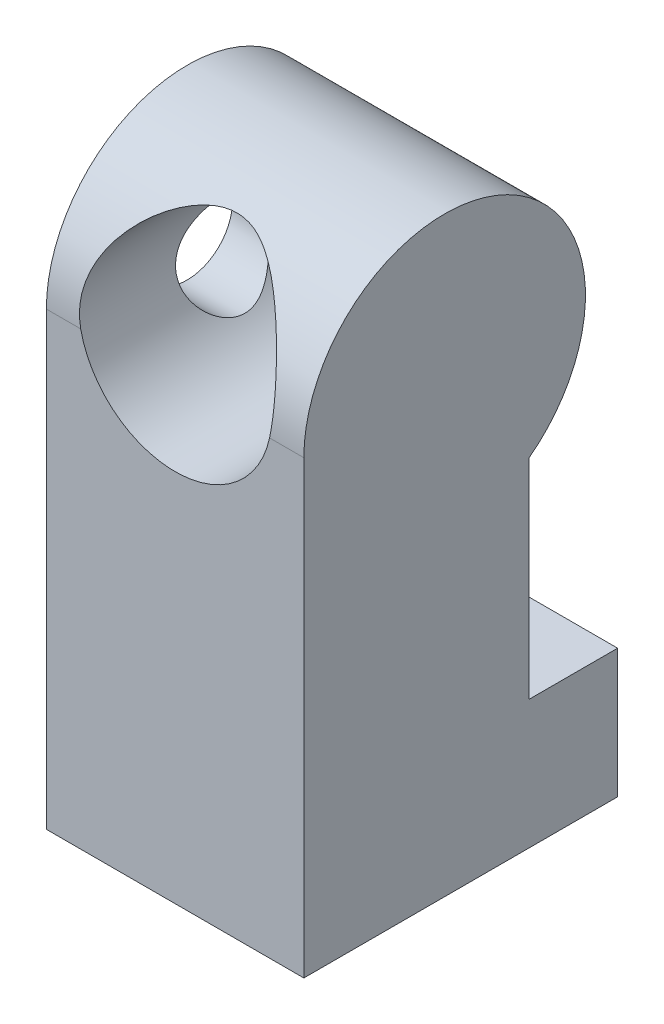
ISO-10303-21;
HEADER;
FILE_DESCRIPTION(('STEP AP214'),'2;1');
FILE_NAME('part.step','',(''),(''),'','','');
FILE_SCHEMA(('AUTOMOTIVE_DESIGN { 1 0 10303 214 1 1 1 1 }'));
ENDSEC;
DATA;
#1=APPLICATION_CONTEXT('core data for automotive mechanical design processes');
#2=APPLICATION_PROTOCOL_DEFINITION('international standard','automotive_design',2000,#1);
#3=PRODUCT_CONTEXT('',#1,'mechanical');
#4=PRODUCT('Part','Part','',(#3));
#5=PRODUCT_RELATED_PRODUCT_CATEGORY('part','',(#4));
#6=PRODUCT_DEFINITION_FORMATION('','',#4);
#7=PRODUCT_DEFINITION_CONTEXT('part definition',#1,'design');
#8=PRODUCT_DEFINITION('design','',#6,#7);
#9=PRODUCT_DEFINITION_SHAPE('','',#8);
#10=(LENGTH_UNIT() NAMED_UNIT(*) SI_UNIT(.MILLI.,.METRE.));
#11=(NAMED_UNIT(*) PLANE_ANGLE_UNIT() SI_UNIT($,.RADIAN.));
#12=(NAMED_UNIT(*) SI_UNIT($,.STERADIAN.) SOLID_ANGLE_UNIT());
#13=UNCERTAINTY_MEASURE_WITH_UNIT(LENGTH_MEASURE(1.E-05),#10,'distance_accuracy_value','');
#14=(GEOMETRIC_REPRESENTATION_CONTEXT(3) GLOBAL_UNCERTAINTY_ASSIGNED_CONTEXT((#13)) GLOBAL_UNIT_ASSIGNED_CONTEXT((#10,
#11,#12)) REPRESENTATION_CONTEXT('',''));
#15=CARTESIAN_POINT('',(0.,0.,0.));
#16=DIRECTION('',(0.,0.,1.));
#17=DIRECTION('',(1.,0.,0.));
#18=AXIS2_PLACEMENT_3D('',#15,#16,#17);
#19=CARTESIAN_POINT('',(3.2,3.2,0.));
#20=DIRECTION('',(0.,0.,1.));
#21=DIRECTION('',(0.,-1.,0.));
#22=AXIS2_PLACEMENT_3D('',#19,#20,#21);
#23=PLANE('',#22);
#24=DIRECTION('',(0.,1.,0.));
#25=VECTOR('',#24,1.);
#26=CARTESIAN_POINT('',(-3.2,3.2,0.));
#27=LINE('',#26,#25);
#28=CARTESIAN_POINT('',(-3.2,0.,0.));
#29=VERTEX_POINT('',#28);
#30=CARTESIAN_POINT('',(-3.2,3.2,0.));
#31=VERTEX_POINT('',#30);
#32=EDGE_CURVE('E168',#29,#31,#27,.T.);
#33=ORIENTED_EDGE('',*,*,#32,.T.);
#34=DIRECTION('',(-1.,0.,0.));
#35=VECTOR('',#34,1.);
#36=CARTESIAN_POINT('',(3.2,3.2,0.));
#37=LINE('',#36,#35);
#38=CARTESIAN_POINT('',(3.2,3.2,0.));
#39=VERTEX_POINT('',#38);
#40=EDGE_CURVE('E11',#39,#31,#37,.T.);
#41=ORIENTED_EDGE('',*,*,#40,.F.);
#42=DIRECTION('',(0.,1.,0.));
#43=VECTOR('',#42,1.);
#44=CARTESIAN_POINT('',(3.2,3.2,0.));
#45=LINE('',#44,#43);
#46=CARTESIAN_POINT('',(3.2,0.,0.));
#47=VERTEX_POINT('',#46);
#48=EDGE_CURVE('E174',#47,#39,#45,.T.);
#49=ORIENTED_EDGE('',*,*,#48,.F.);
#50=DIRECTION('',(-1.,0.,0.));
#51=VECTOR('',#50,1.);
#52=CARTESIAN_POINT('',(3.2,0.,0.));
#53=LINE('',#52,#51);
#54=EDGE_CURVE('E175',#47,#29,#53,.T.);
#55=ORIENTED_EDGE('',*,*,#54,.T.);
#56=EDGE_LOOP('',(#33,#41,#49,#55));
#57=FACE_BOUND('',#56,.T.);
#58=ADVANCED_FACE('F35',(#57),#23,.F.);
#59=CARTESIAN_POINT('',(3.2,3.20000000000001,2.19999999999999));
#60=DIRECTION('',(0.,-1.,0.));
#61=DIRECTION('',(0.,0.,-1.));
#62=AXIS2_PLACEMENT_3D('',#59,#60,#61);
#63=PLANE('',#62);
#64=DIRECTION('',(0.,0.,1.));
#65=VECTOR('',#64,1.);
#66=CARTESIAN_POINT('',(-3.2,3.20000000000001,2.19999999999999));
#67=LINE('',#66,#65);
#68=CARTESIAN_POINT('',(-3.2,3.20000000000001,2.19999999999999));
#69=VERTEX_POINT('',#68);
#70=EDGE_CURVE('E162',#31,#69,#67,.T.);
#71=ORIENTED_EDGE('',*,*,#70,.T.);
#72=DIRECTION('',(-1.,0.,0.));
#73=VECTOR('',#72,1.);
#74=CARTESIAN_POINT('',(3.2,3.20000000000001,2.19999999999999));
#75=LINE('',#74,#73);
#76=CARTESIAN_POINT('',(3.2,3.20000000000001,2.19999999999999));
#77=VERTEX_POINT('',#76);
#78=EDGE_CURVE('E48',#77,#69,#75,.T.);
#79=ORIENTED_EDGE('',*,*,#78,.F.);
#80=DIRECTION('',(0.,0.,1.));
#81=VECTOR('',#80,1.);
#82=CARTESIAN_POINT('',(3.2,3.20000000000001,2.19999999999999));
#83=LINE('',#82,#81);
#84=EDGE_CURVE('E207',#39,#77,#83,.T.);
#85=ORIENTED_EDGE('',*,*,#84,.F.);
#86=ORIENTED_EDGE('',*,*,#40,.T.);
#87=EDGE_LOOP('',(#71,#79,#85,#86));
#88=FACE_BOUND('',#87,.T.);
#89=ADVANCED_FACE('F213',(#88),#63,.F.);
#90=CARTESIAN_POINT('',(3.2,8.4,2.2));
#91=DIRECTION('',(0.,0.,1.));
#92=DIRECTION('',(0.,-1.,0.));
#93=AXIS2_PLACEMENT_3D('',#90,#91,#92);
#94=PLANE('',#93);
#95=DIRECTION('',(0.,1.,0.));
#96=VECTOR('',#95,1.);
#97=CARTESIAN_POINT('',(-3.2,8.4,2.2));
#98=LINE('',#97,#96);
#99=CARTESIAN_POINT('',(-3.2,8.4,2.2));
#100=VERTEX_POINT('',#99);
#101=EDGE_CURVE('E155',#69,#100,#98,.T.);
#102=ORIENTED_EDGE('',*,*,#101,.T.);
#103=DIRECTION('',(-1.,0.,0.));
#104=VECTOR('',#103,1.);
#105=CARTESIAN_POINT('',(3.2,8.4,2.2));
#106=LINE('',#105,#104);
#107=CARTESIAN_POINT('',(3.2,8.4,2.2));
#108=VERTEX_POINT('',#107);
#109=EDGE_CURVE('E140',#108,#100,#106,.T.);
#110=ORIENTED_EDGE('',*,*,#109,.F.);
#111=DIRECTION('',(0.,1.,0.));
#112=VECTOR('',#111,1.);
#113=CARTESIAN_POINT('',(3.2,8.4,2.2));
#114=LINE('',#113,#112);
#115=EDGE_CURVE('E156',#77,#108,#114,.T.);
#116=ORIENTED_EDGE('',*,*,#115,.F.);
#117=ORIENTED_EDGE('',*,*,#78,.T.);
#118=EDGE_LOOP('',(#102,#110,#116,#117));
#119=FACE_BOUND('',#118,.T.);
#120=ADVANCED_FACE('F153',(#119),#94,.F.);
#121=CARTESIAN_POINT('',(3.2,11.2,4.3));
#122=DIRECTION('',(-1.,0.,0.));
#123=DIRECTION('',(0.,0.,1.));
#124=AXIS2_PLACEMENT_3D('',#121,#122,#123);
#125=CYLINDRICAL_SURFACE('',#124,3.5);
#126=DIRECTION('',(-1.,0.,0.));
#127=VECTOR('',#126,1.);
#128=CARTESIAN_POINT('',(3.2,11.2,7.8));
#129=LINE('',#128,#127);
#130=CARTESIAN_POINT('',(-2.3473389188611,11.2,7.8));
#131=VERTEX_POINT('',#130);
#132=CARTESIAN_POINT('',(-3.2,11.2,7.8));
#133=VERTEX_POINT('',#132);
#134=EDGE_CURVE('E134',#131,#133,#129,.T.);
#135=ORIENTED_EDGE('',*,*,#134,.F.);
#136=CARTESIAN_POINT('',(-2.3473389188611,11.2,7.8));
#137=CARTESIAN_POINT('',(-2.35952324799212,11.2571477217374,7.80001181867057));
#138=CARTESIAN_POINT('',(-2.36959863933398,11.3147437700653,7.79860061614223));
#139=CARTESIAN_POINT('',(-2.38551560428378,11.4303604078272,7.79288728833139));
#140=CARTESIAN_POINT('',(-2.39135828784083,11.4883808819292,7.78858592151156));
#141=CARTESIAN_POINT('',(-2.3987800738924,11.6040893596738,7.77707880110764));
#142=CARTESIAN_POINT('',(-2.40038218120076,11.6617774560698,7.76988896332483));
#143=CARTESIAN_POINT('',(-2.39946378384657,11.7766765678628,7.75265487837301));
#144=CARTESIAN_POINT('',(-2.39694326407962,11.8338875815112,7.74261062074615));
#145=CARTESIAN_POINT('',(-2.38336595556229,12.0041050362091,7.7083356117771));
#146=CARTESIAN_POINT('',(-2.36630384227635,12.1158698662925,7.67994514796453));
#147=CARTESIAN_POINT('',(-2.3176646602164,12.3331483242968,7.61344895138059));
#148=CARTESIAN_POINT('',(-2.28607230536925,12.4386552364825,7.57533300607753));
#149=CARTESIAN_POINT('',(-2.20809491628295,12.6473156467437,7.48884504357403));
#150=CARTESIAN_POINT('',(-2.16097838899282,12.7500037379456,7.44001706082533));
#151=CARTESIAN_POINT('',(-2.05467670041225,12.9452636074864,7.335840219662));
#152=CARTESIAN_POINT('',(-1.99548649772665,13.037831135076,7.28048864139242));
#153=CARTESIAN_POINT('',(-1.8535357377681,13.2301856227216,7.15379750966277));
#154=CARTESIAN_POINT('',(-1.76842986956987,13.3276050228198,7.08149734246403));
#155=CARTESIAN_POINT('',(-1.58471660055204,13.5069850297708,6.93462775579362));
#156=CARTESIAN_POINT('',(-1.48609165576466,13.5889252148605,6.86005548720431));
#157=CARTESIAN_POINT('',(-1.28326463330636,13.7316290827611,6.71871956278775));
#158=CARTESIAN_POINT('',(-1.17995301376685,13.7934819252775,6.65177703389459));
#159=CARTESIAN_POINT('',(-0.961384510809961,13.9024084058305,6.52572729179699));
#160=CARTESIAN_POINT('',(-0.846154035362334,13.94951382379,6.46660339102304));
#161=CARTESIAN_POINT('',(-0.647727577127012,14.0123430464996,6.38383834027692));
#162=CARTESIAN_POINT('',(-0.56831867472429,14.0332378876336,6.35514190190293));
#163=CARTESIAN_POINT('',(-0.404993818729679,14.0670453902327,6.3077106103014));
#164=CARTESIAN_POINT('',(-0.321088276567455,14.0799756925631,6.28895375460871));
#165=CARTESIAN_POINT('',(-0.149491208394771,14.0969014461754,6.2642337035912));
#166=CARTESIAN_POINT('',(-0.061768949036159,14.1008005995437,6.25840842288825));
#167=CARTESIAN_POINT('',(0.113347387177273,14.0989222746351,6.26118525247281));
#168=CARTESIAN_POINT('',(0.200741362317399,14.0931420111559,6.26979151536346));
#169=CARTESIAN_POINT('',(0.38002426984234,14.0716013071517,6.3010690476172));
#170=CARTESIAN_POINT('',(0.471581842713509,14.0549676323807,6.32496702821198));
#171=CARTESIAN_POINT('',(0.648946825699923,14.0124101926336,6.38366151371945));
#172=CARTESIAN_POINT('',(0.734736399221444,13.9864590543929,6.41849009267811));
#173=CARTESIAN_POINT('',(0.882269209875887,13.9330157141791,6.48679788954712));
#174=CARTESIAN_POINT('',(0.945212765686842,13.9070584023299,6.51895300854011));
#175=CARTESIAN_POINT('',(1.06746047311732,13.8505953738598,6.58610481874926));
#176=CARTESIAN_POINT('',(1.12676250614175,13.8200870442471,6.62110313711189));
#177=CARTESIAN_POINT('',(1.29954031385501,13.7220720622161,6.72868720689748));
#178=CARTESIAN_POINT('',(1.40781900138491,13.6481010718627,6.80382746204864));
#179=CARTESIAN_POINT('',(1.61639176669799,13.4793913271792,6.95861963929727));
#180=CARTESIAN_POINT('',(1.71592187098403,13.383735839555,7.03829291655651));
#181=CARTESIAN_POINT('',(1.89862659550262,13.1745927626624,7.19271972414267));
#182=CARTESIAN_POINT('',(1.98182520751841,13.0611317785763,7.26748036225121));
#183=CARTESIAN_POINT('',(2.11729235303731,12.8364166045219,7.39615262794246));
#184=CARTESIAN_POINT('',(2.17237560238322,12.7276812865925,7.45148910825451));
#185=CARTESIAN_POINT('',(2.26644162806675,12.4990375293626,7.55238946581503));
#186=CARTESIAN_POINT('',(2.30542916484462,12.3791324065019,7.59795623061858));
#187=CARTESIAN_POINT('',(2.3498291454817,12.1924122450753,7.65700281785587));
#188=CARTESIAN_POINT('',(2.36230923884271,12.1286856010148,7.67520301505509));
#189=CARTESIAN_POINT('',(2.38212491102286,11.999562026687,7.70809707788925));
#190=CARTESIAN_POINT('',(2.38946329864895,11.9341660286224,7.72279285501696));
#191=CARTESIAN_POINT('',(2.39872518579679,11.802361890113,7.74842924317227));
#192=CARTESIAN_POINT('',(2.40065641613778,11.7359553313239,7.75937519578144));
#193=CARTESIAN_POINT('',(2.39895186636154,11.6027230568351,7.77740236223998));
#194=CARTESIAN_POINT('',(2.39531979451449,11.5358976498855,7.7844861461866));
#195=CARTESIAN_POINT('',(2.38451462581159,11.4240465803309,7.79311564200003));
#196=CARTESIAN_POINT('',(2.37886287652598,11.3789465891278,7.79571088870466));
#197=CARTESIAN_POINT('',(2.3650076462582,11.2891432677127,7.79915350020635));
#198=CARTESIAN_POINT('',(2.35680805913186,11.2444394385562,7.80000351725482));
#199=CARTESIAN_POINT('',(2.3473389188611,11.2,7.8));
#200=B_SPLINE_CURVE_WITH_KNOTS('',3,(#136,#137,#138,#139,#140,#141,#142,#143,#144,#145,#146,
#147,#148,#149,#150,#151,#152,#153,#154,#155,#156,#157,#158,#159,#160,#161,#162,#163,#164,#165,
#166,#167,#168,#169,#170,#171,#172,#173,#174,#175,#176,#177,#178,#179,#180,#181,#182,#183,#184,
#185,#186,#187,#188,#189,#190,#191,#192,#193,#194,#195,#196,#197,#198,#199),.UNSPECIFIED.,.F.,
.F.,(4,2,2,2,2,2,2,2,2,2,2,2,2,2,2,2,2,2,2,2,2,2,2,2,2,2,2,2,2,2,2,4),(0.,0.175237440381034,
0.35042891134353,0.524668014814339,0.698907756660256,1.04686867533736,1.39519649537508,
1.76309807782819,2.13115359418281,2.57414809278723,3.01772301461146,3.42986501795747,
3.84111266440891,4.10124897819194,4.36080701764206,4.62312019539684,4.88550886538463,
5.17215450827925,5.45964925644542,5.68524281978454,5.91096641102047,6.36265437457839,
6.83912330739457,7.31488695708917,7.71498529590946,8.1149652174138,8.31702682714793,
8.51897796858323,8.720640224955,8.92216811998134,9.0586481727044,9.19492066068158),.UNSPECIFIED.);
#201=CARTESIAN_POINT('',(2.3473389188611,11.2,7.8));
#202=VERTEX_POINT('',#201);
#203=EDGE_CURVE('E54',#131,#202,#200,.T.);
#204=ORIENTED_EDGE('',*,*,#203,.T.);
#205=CARTESIAN_POINT('',(3.2,11.2,7.8));
#206=VERTEX_POINT('',#205);
#207=EDGE_CURVE('E131',#206,#202,#129,.T.);
#208=ORIENTED_EDGE('',*,*,#207,.F.);
#209=CARTESIAN_POINT('',(3.2,11.2,4.3));
#210=DIRECTION('',(1.,0.,0.));
#211=DIRECTION('',(0.,0.,-1.));
#212=AXIS2_PLACEMENT_3D('',#209,#210,#211);
#213=CIRCLE('',#212,3.5);
#214=EDGE_CURVE('E187',#108,#206,#213,.T.);
#215=ORIENTED_EDGE('',*,*,#214,.F.);
#216=ORIENTED_EDGE('',*,*,#109,.T.);
#217=CARTESIAN_POINT('',(-3.2,11.2,4.3));
#218=DIRECTION('',(1.,0.,0.));
#219=DIRECTION('',(0.,0.,-1.));
#220=AXIS2_PLACEMENT_3D('',#217,#218,#219);
#221=CIRCLE('',#220,3.5);
#222=EDGE_CURVE('E164',#100,#133,#221,.T.);
#223=ORIENTED_EDGE('',*,*,#222,.T.);
#224=EDGE_LOOP('',(#135,#204,#208,#215,#216,#223));
#225=FACE_BOUND('',#224,.T.);
#226=ADVANCED_FACE('F129',(#225),#125,.T.);
#227=CARTESIAN_POINT('',(3.2,0.,7.8));
#228=DIRECTION('',(0.,0.,-1.));
#229=DIRECTION('',(-1.,0.,0.));
#230=AXIS2_PLACEMENT_3D('',#227,#228,#229);
#231=PLANE('',#230);
#232=ORIENTED_EDGE('',*,*,#207,.T.);
#233=CARTESIAN_POINT('',(0.,11.7,7.8));
#234=DIRECTION('',(0.,0.,1.));
#235=DIRECTION('',(1.,0.,0.));
#236=AXIS2_PLACEMENT_3D('',#233,#234,#235);
#237=CIRCLE('',#236,2.4);
#238=EDGE_CURVE('E120',#131,#202,#237,.T.);
#239=ORIENTED_EDGE('',*,*,#238,.F.);
#240=ORIENTED_EDGE('',*,*,#134,.T.);
#241=DIRECTION('',(0.,-1.,0.));
#242=VECTOR('',#241,1.);
#243=CARTESIAN_POINT('',(-3.2,0.,7.8));
#244=LINE('',#243,#242);
#245=CARTESIAN_POINT('',(-3.2,0.,7.8));
#246=VERTEX_POINT('',#245);
#247=EDGE_CURVE('E166',#133,#246,#244,.T.);
#248=ORIENTED_EDGE('',*,*,#247,.T.);
#249=DIRECTION('',(-1.,0.,0.));
#250=VECTOR('',#249,1.);
#251=CARTESIAN_POINT('',(3.2,0.,7.8));
#252=LINE('',#251,#250);
#253=CARTESIAN_POINT('',(3.2,0.,7.8));
#254=VERTEX_POINT('',#253);
#255=EDGE_CURVE('E144',#254,#246,#252,.T.);
#256=ORIENTED_EDGE('',*,*,#255,.F.);
#257=DIRECTION('',(0.,-1.,0.));
#258=VECTOR('',#257,1.);
#259=CARTESIAN_POINT('',(3.2,0.,7.8));
#260=LINE('',#259,#258);
#261=EDGE_CURVE('E139',#206,#254,#260,.T.);
#262=ORIENTED_EDGE('',*,*,#261,.F.);
#263=EDGE_LOOP('',(#232,#239,#240,#248,#256,#262));
#264=FACE_BOUND('',#263,.T.);
#265=ADVANCED_FACE('F137',(#264),#231,.F.);
#266=CARTESIAN_POINT('',(3.2,0.,0.));
#267=DIRECTION('',(0.,1.,0.));
#268=DIRECTION('',(0.,0.,1.));
#269=AXIS2_PLACEMENT_3D('',#266,#267,#268);
#270=PLANE('',#269);
#271=DIRECTION('',(-1.,0.,0.));
#272=VECTOR('',#271,1.);
#273=CARTESIAN_POINT('',(-2.4,0.,6.4));
#274=LINE('',#273,#272);
#275=CARTESIAN_POINT('',(2.4,0.,6.4));
#276=VERTEX_POINT('',#275);
#277=CARTESIAN_POINT('',(-2.4,0.,6.4));
#278=VERTEX_POINT('',#277);
#279=EDGE_CURVE('E274',#276,#278,#274,.T.);
#280=ORIENTED_EDGE('',*,*,#279,.F.);
#281=DIRECTION('',(0.,0.,1.));
#282=VECTOR('',#281,1.);
#283=CARTESIAN_POINT('',(2.4,0.,3.1));
#284=LINE('',#283,#282);
#285=CARTESIAN_POINT('',(2.4,0.,3.1));
#286=VERTEX_POINT('',#285);
#287=EDGE_CURVE('E62',#286,#276,#284,.T.);
#288=ORIENTED_EDGE('',*,*,#287,.F.);
#289=DIRECTION('',(1.,0.,0.));
#290=VECTOR('',#289,1.);
#291=CARTESIAN_POINT('',(-2.4,0.,3.1));
#292=LINE('',#291,#290);
#293=CARTESIAN_POINT('',(-2.4,0.,3.1));
#294=VERTEX_POINT('',#293);
#295=EDGE_CURVE('E199',#294,#286,#292,.T.);
#296=ORIENTED_EDGE('',*,*,#295,.F.);
#297=DIRECTION('',(0.,0.,-1.));
#298=VECTOR('',#297,1.);
#299=CARTESIAN_POINT('',(-2.4,0.,3.1));
#300=LINE('',#299,#298);
#301=EDGE_CURVE('E277',#278,#294,#300,.T.);
#302=ORIENTED_EDGE('',*,*,#301,.F.);
#303=EDGE_LOOP('',(#280,#288,#296,#302));
#304=FACE_BOUND('',#303,.T.);
#305=DIRECTION('',(0.,0.,-1.));
#306=VECTOR('',#305,1.);
#307=CARTESIAN_POINT('',(-3.2,0.,0.));
#308=LINE('',#307,#306);
#309=EDGE_CURVE('E173',#246,#29,#308,.T.);
#310=ORIENTED_EDGE('',*,*,#309,.T.);
#311=ORIENTED_EDGE('',*,*,#54,.F.);
#312=DIRECTION('',(0.,0.,-1.));
#313=VECTOR('',#312,1.);
#314=CARTESIAN_POINT('',(3.2,0.,0.));
#315=LINE('',#314,#313);
#316=EDGE_CURVE('E177',#254,#47,#315,.T.);
#317=ORIENTED_EDGE('',*,*,#316,.F.);
#318=ORIENTED_EDGE('',*,*,#255,.T.);
#319=EDGE_LOOP('',(#310,#311,#317,#318));
#320=FACE_BOUND('',#319,.T.);
#321=ADVANCED_FACE('F212',(#304,#320),#270,.F.);
#322=CARTESIAN_POINT('',(3.2,11.2,4.3));
#323=DIRECTION('',(1.,0.,0.));
#324=DIRECTION('',(0.,0.,-1.));
#325=AXIS2_PLACEMENT_3D('',#322,#323,#324);
#326=PLANE('',#325);
#327=ORIENTED_EDGE('',*,*,#48,.T.);
#328=ORIENTED_EDGE('',*,*,#84,.T.);
#329=ORIENTED_EDGE('',*,*,#115,.T.);
#330=ORIENTED_EDGE('',*,*,#214,.T.);
#331=ORIENTED_EDGE('',*,*,#261,.T.);
#332=ORIENTED_EDGE('',*,*,#316,.T.);
#333=EDGE_LOOP('',(#327,#328,#329,#330,#331,#332));
#334=FACE_BOUND('',#333,.T.);
#335=ADVANCED_FACE('F209',(#334),#326,.T.);
#336=CARTESIAN_POINT('',(-3.2,11.2,4.3));
#337=DIRECTION('',(1.,0.,0.));
#338=DIRECTION('',(0.,0.,-1.));
#339=AXIS2_PLACEMENT_3D('',#336,#337,#338);
#340=PLANE('',#339);
#341=CARTESIAN_POINT('',(-3.2,11.2,4.3));
#342=DIRECTION('',(-1.,0.,0.));
#343=DIRECTION('',(0.,0.,1.));
#344=AXIS2_PLACEMENT_3D('',#341,#342,#343);
#345=CIRCLE('',#344,1.125);
#346=CARTESIAN_POINT('',(-3.2,11.2,5.425));
#347=VERTEX_POINT('',#346);
#348=EDGE_CURVE('E135',#347,#347,#345,.T.);
#349=ORIENTED_EDGE('',*,*,#348,.F.);
#350=EDGE_LOOP('',(#349));
#351=FACE_BOUND('',#350,.T.);
#352=ORIENTED_EDGE('',*,*,#32,.F.);
#353=ORIENTED_EDGE('',*,*,#309,.F.);
#354=ORIENTED_EDGE('',*,*,#247,.F.);
#355=ORIENTED_EDGE('',*,*,#222,.F.);
#356=ORIENTED_EDGE('',*,*,#101,.F.);
#357=ORIENTED_EDGE('',*,*,#70,.F.);
#358=EDGE_LOOP('',(#352,#353,#354,#355,#356,#357));
#359=FACE_BOUND('',#358,.T.);
#360=ADVANCED_FACE('F161',(#351,#359),#340,.F.);
#361=CARTESIAN_POINT('',(2.4,8.9,3.1));
#362=DIRECTION('',(1.,0.,0.));
#363=DIRECTION('',(0.,0.,-1.));
#364=AXIS2_PLACEMENT_3D('',#361,#362,#363);
#365=PLANE('',#364);
#366=ORIENTED_EDGE('',*,*,#287,.T.);
#367=DIRECTION('',(0.,-1.,0.));
#368=VECTOR('',#367,1.);
#369=CARTESIAN_POINT('',(2.4,8.9,6.4));
#370=LINE('',#369,#368);
#371=CARTESIAN_POINT('',(2.4,8.9,6.4));
#372=VERTEX_POINT('',#371);
#373=EDGE_CURVE('E203',#372,#276,#370,.T.);
#374=ORIENTED_EDGE('',*,*,#373,.F.);
#375=DIRECTION('',(0.,0.,1.));
#376=VECTOR('',#375,1.);
#377=CARTESIAN_POINT('',(2.4,8.9,3.1));
#378=LINE('',#377,#376);
#379=CARTESIAN_POINT('',(2.4,8.9,3.1));
#380=VERTEX_POINT('',#379);
#381=EDGE_CURVE('E288',#380,#372,#378,.T.);
#382=ORIENTED_EDGE('',*,*,#381,.F.);
#383=DIRECTION('',(0.,-1.,0.));
#384=VECTOR('',#383,1.);
#385=CARTESIAN_POINT('',(2.4,8.9,3.1));
#386=LINE('',#385,#384);
#387=EDGE_CURVE('E190',#380,#286,#386,.T.);
#388=ORIENTED_EDGE('',*,*,#387,.T.);
#389=EDGE_LOOP('',(#366,#374,#382,#388));
#390=FACE_BOUND('',#389,.T.);
#391=ADVANCED_FACE('F252',(#390),#365,.F.);
#392=CARTESIAN_POINT('',(-2.4,8.9,3.1));
#393=DIRECTION('',(0.,0.,-1.));
#394=DIRECTION('',(-1.,0.,0.));
#395=AXIS2_PLACEMENT_3D('',#392,#393,#394);
#396=PLANE('',#395);
#397=ORIENTED_EDGE('',*,*,#295,.T.);
#398=ORIENTED_EDGE('',*,*,#387,.F.);
#399=DIRECTION('',(1.,0.,0.));
#400=VECTOR('',#399,1.);
#401=CARTESIAN_POINT('',(-2.4,8.9,3.1));
#402=LINE('',#401,#400);
#403=CARTESIAN_POINT('',(-2.4,8.9,3.1));
#404=VERTEX_POINT('',#403);
#405=EDGE_CURVE('E205',#404,#380,#402,.T.);
#406=ORIENTED_EDGE('',*,*,#405,.F.);
#407=DIRECTION('',(0.,-1.,0.));
#408=VECTOR('',#407,1.);
#409=CARTESIAN_POINT('',(-2.4,8.9,3.1));
#410=LINE('',#409,#408);
#411=EDGE_CURVE('E192',#404,#294,#410,.T.);
#412=ORIENTED_EDGE('',*,*,#411,.T.);
#413=EDGE_LOOP('',(#397,#398,#406,#412));
#414=FACE_BOUND('',#413,.T.);
#415=ADVANCED_FACE('F248',(#414),#396,.F.);
#416=CARTESIAN_POINT('',(-2.4,8.9,3.1));
#417=DIRECTION('',(-1.,0.,0.));
#418=DIRECTION('',(0.,0.,1.));
#419=AXIS2_PLACEMENT_3D('',#416,#417,#418);
#420=PLANE('',#419);
#421=ORIENTED_EDGE('',*,*,#301,.T.);
#422=ORIENTED_EDGE('',*,*,#411,.F.);
#423=DIRECTION('',(0.,0.,-1.));
#424=VECTOR('',#423,1.);
#425=CARTESIAN_POINT('',(-2.4,8.9,3.1));
#426=LINE('',#425,#424);
#427=CARTESIAN_POINT('',(-2.4,8.9,6.4));
#428=VERTEX_POINT('',#427);
#429=EDGE_CURVE('E283',#428,#404,#426,.T.);
#430=ORIENTED_EDGE('',*,*,#429,.F.);
#431=DIRECTION('',(0.,-1.,0.));
#432=VECTOR('',#431,1.);
#433=CARTESIAN_POINT('',(-2.4,8.9,6.4));
#434=LINE('',#433,#432);
#435=EDGE_CURVE('E196',#428,#278,#434,.T.);
#436=ORIENTED_EDGE('',*,*,#435,.T.);
#437=EDGE_LOOP('',(#421,#422,#430,#436));
#438=FACE_BOUND('',#437,.T.);
#439=ADVANCED_FACE('F251',(#438),#420,.F.);
#440=CARTESIAN_POINT('',(-2.4,8.9,6.4));
#441=DIRECTION('',(0.,0.,1.));
#442=DIRECTION('',(1.,0.,0.));
#443=AXIS2_PLACEMENT_3D('',#440,#441,#442);
#444=PLANE('',#443);
#445=ORIENTED_EDGE('',*,*,#279,.T.);
#446=ORIENTED_EDGE('',*,*,#435,.F.);
#447=DIRECTION('',(-1.,0.,0.));
#448=VECTOR('',#447,1.);
#449=CARTESIAN_POINT('',(-2.4,8.9,6.4));
#450=LINE('',#449,#448);
#451=EDGE_CURVE('E286',#372,#428,#450,.T.);
#452=ORIENTED_EDGE('',*,*,#451,.F.);
#453=ORIENTED_EDGE('',*,*,#373,.T.);
#454=EDGE_LOOP('',(#445,#446,#452,#453));
#455=FACE_BOUND('',#454,.T.);
#456=ADVANCED_FACE('F246',(#455),#444,.F.);
#457=CARTESIAN_POINT('',(0.,8.9,0.));
#458=DIRECTION('',(0.,1.,0.));
#459=DIRECTION('',(0.,0.,1.));
#460=AXIS2_PLACEMENT_3D('',#457,#458,#459);
#461=PLANE('',#460);
#462=ORIENTED_EDGE('',*,*,#381,.T.);
#463=ORIENTED_EDGE('',*,*,#451,.T.);
#464=ORIENTED_EDGE('',*,*,#429,.T.);
#465=ORIENTED_EDGE('',*,*,#405,.T.);
#466=EDGE_LOOP('',(#462,#463,#464,#465));
#467=FACE_BOUND('',#466,.T.);
#468=ADVANCED_FACE('F242',(#467),#461,.F.);
#469=CARTESIAN_POINT('',(-1.2,11.2,4.3));
#470=DIRECTION('',(-1.,0.,0.));
#471=DIRECTION('',(0.,0.,1.));
#472=AXIS2_PLACEMENT_3D('',#469,#470,#471);
#473=CYLINDRICAL_SURFACE('',#472,1.125);
#474=CARTESIAN_POINT('',(-2.3473389188611,11.2,5.425));
#475=CARTESIAN_POINT('',(-2.33380410602163,11.1364775605983,5.42499601220494));
#476=CARTESIAN_POINT('',(-2.31765742562919,11.0734507870776,5.41959132494665));
#477=CARTESIAN_POINT('',(-2.28084354065195,10.9503991675026,5.39874390966938));
#478=CARTESIAN_POINT('',(-2.2601672163323,10.8903806821158,5.38328080509446));
#479=CARTESIAN_POINT('',(-2.21551034200095,10.7751711275326,5.34347399628676));
#480=CARTESIAN_POINT('',(-2.19155033632217,10.71995328384,5.31918406757623));
#481=CARTESIAN_POINT('',(-2.14145296258323,10.6148391197134,5.26269200775789));
#482=CARTESIAN_POINT('',(-2.11531519619826,10.5649437766173,5.23048842708919));
#483=CARTESIAN_POINT('',(-2.05930168968675,10.4659619290432,5.15504305953269));
#484=CARTESIAN_POINT('',(-2.02932882184068,10.417555013535,5.11098119441066));
#485=CARTESIAN_POINT('',(-1.9704227391338,10.3287706532637,5.01475181153027));
#486=CARTESIAN_POINT('',(-1.94148961245621,10.2883938882484,4.96258360824019));
#487=CARTESIAN_POINT('',(-1.89210040798983,10.2230685504033,4.86055362035154));
#488=CARTESIAN_POINT('',(-1.87105058528707,10.1966539937102,4.81192023272605));
#489=CARTESIAN_POINT('',(-1.83330546508652,10.1508476443905,4.70989890071472));
#490=CARTESIAN_POINT('',(-1.81660238271409,10.1314432721975,4.65651968930609));
#491=CARTESIAN_POINT('',(-1.79199009466161,10.1034229241155,4.55568827383873));
#492=CARTESIAN_POINT('',(-1.78304880822915,10.0935068781701,4.50885417459118));
#493=CARTESIAN_POINT('',(-1.77053187067493,10.0797200662641,4.41360786828337));
#494=CARTESIAN_POINT('',(-1.76695135906743,10.0758438240286,4.36519713147112));
#495=CARTESIAN_POINT('',(-1.7656258787011,10.0744026374079,4.26810488358581));
#496=CARTESIAN_POINT('',(-1.76789225217767,10.0768499599724,4.21942302929873));
#497=CARTESIAN_POINT('',(-1.77797429241531,10.0879019129147,4.12334980487238));
#498=CARTESIAN_POINT('',(-1.78579345062546,10.0965104173129,4.07595926615669));
#499=CARTESIAN_POINT('',(-1.80591351695063,10.1192092557542,3.9842076767918));
#500=CARTESIAN_POINT('',(-1.81815679945743,10.1332292565746,3.93981601199072));
#501=CARTESIAN_POINT('',(-1.84601766252827,10.1661537862204,3.85401502048968));
#502=CARTESIAN_POINT('',(-1.86163772705419,10.1850619127686,3.81260791929446));
#503=CARTESIAN_POINT('',(-1.90348152483538,10.237682867995,3.71340013408705));
#504=CARTESIAN_POINT('',(-1.93112856281814,10.2740925053402,3.6576213110833));
#505=CARTESIAN_POINT('',(-1.98861356265342,10.3554162551107,3.55390441625532));
#506=CARTESIAN_POINT('',(-2.01845509932831,10.4003444408424,3.50597956759648));
#507=CARTESIAN_POINT('',(-2.07832162046633,10.4983717217809,3.41811852562445));
#508=CARTESIAN_POINT('',(-2.10834530791607,10.5515505563713,3.37827012799924));
#509=CARTESIAN_POINT('',(-2.16625635870806,10.6649246316874,3.30815493915979));
#510=CARTESIAN_POINT('',(-2.19414477936842,10.7251163621187,3.27788338222584));
#511=CARTESIAN_POINT('',(-2.24645375260998,10.8524990058328,3.22779462101227));
#512=CARTESIAN_POINT('',(-2.2708091772563,10.9197893783585,3.20815897820036));
#513=CARTESIAN_POINT('',(-2.31383596961299,11.0585816516333,3.18169870612463));
#514=CARTESIAN_POINT('',(-2.33251390890241,11.130078568046,3.17485921790451));
#515=CARTESIAN_POINT('',(-2.36103577030789,11.2645909919672,3.17512580062382));
#516=CARTESIAN_POINT('',(-2.37173815491701,11.3274301945146,3.18045369508386));
#517=CARTESIAN_POINT('',(-2.3879713172288,11.4519525734356,3.20176166203756));
#518=CARTESIAN_POINT('',(-2.39350460511933,11.5136362966501,3.21773655772922));
#519=CARTESIAN_POINT('',(-2.39956020324518,11.6283812450804,3.25813082045599));
#520=CARTESIAN_POINT('',(-2.40047602490607,11.6817260353587,3.28169616259418));
#521=CARTESIAN_POINT('',(-2.39907264064777,11.784096515252,3.33675840753973));
#522=CARTESIAN_POINT('',(-2.39675319927425,11.8331218902347,3.36825588749146));
#523=CARTESIAN_POINT('',(-2.38973742781581,11.9267516196374,3.439191152168));
#524=CARTESIAN_POINT('',(-2.38498432298786,11.9712184328709,3.47880437920908));
#525=CARTESIAN_POINT('',(-2.37421545143315,12.0532953857171,3.56445066584115));
#526=CARTESIAN_POINT('',(-2.36819925351225,12.0909031755857,3.61048591597404));
#527=CARTESIAN_POINT('',(-2.35570701633602,12.1603981813392,3.71076653953684));
#528=CARTESIAN_POINT('',(-2.34922475312853,12.1918184250189,3.76533566265517));
#529=CARTESIAN_POINT('',(-2.337422559599,12.2451661301869,3.87905253232682));
#530=CARTESIAN_POINT('',(-2.33210260471924,12.2670937922479,3.93820018210742));
#531=CARTESIAN_POINT('',(-2.3236260336266,12.3008920395099,4.05985500531278));
#532=CARTESIAN_POINT('',(-2.32048276876123,12.3127006597348,4.1223804200484));
#533=CARTESIAN_POINT('',(-2.31703583949103,12.3256131765116,4.24859737308193));
#534=CARTESIAN_POINT('',(-2.31673150594003,12.3267195956125,4.31228863303959));
#535=CARTESIAN_POINT('',(-2.31898238684073,12.3183333783439,4.43684622540129));
#536=CARTESIAN_POINT('',(-2.32144591082964,12.3091806195587,4.49773751490328));
#537=CARTESIAN_POINT('',(-2.32862574389176,12.2811275820999,4.61709253676358));
#538=CARTESIAN_POINT('',(-2.3333423663023,12.2622259476258,4.675555930246));
#539=CARTESIAN_POINT('',(-2.34421265125779,12.2150293808897,4.78903103602315));
#540=CARTESIAN_POINT('',(-2.35037888270572,12.1866513222188,4.84400688905298));
#541=CARTESIAN_POINT('',(-2.3629667637851,12.1212984649222,4.94856495793564));
#542=CARTESIAN_POINT('',(-2.36938846793105,12.0843218232274,4.99814601408772));
#543=CARTESIAN_POINT('',(-2.38137151256474,12.0014484950235,5.09204919713999));
#544=CARTESIAN_POINT('',(-2.3869014056677,11.9553182567207,5.13616987872918));
#545=CARTESIAN_POINT('',(-2.39543400008034,11.8561037498372,5.21608236328954));
#546=CARTESIAN_POINT('',(-2.39843679969698,11.8030197518589,5.25187449021223));
#547=CARTESIAN_POINT('',(-2.40060221734877,11.6930373996774,5.31310943085238));
#548=CARTESIAN_POINT('',(-2.39986933949241,11.6362862348143,5.33881244804715));
#549=CARTESIAN_POINT('',(-2.39391820098743,11.5195804414372,5.38042458535054));
#550=CARTESIAN_POINT('',(-2.38870734402285,11.4596312537531,5.39634979715911));
#551=CARTESIAN_POINT('',(-2.37689171462176,11.3660745788908,5.41318425741354));
#552=CARTESIAN_POINT('',(-2.37198891838182,11.3328419861102,5.41762785686126));
#553=CARTESIAN_POINT('',(-2.36074018061544,11.2663613633498,5.42353657837511));
#554=CARTESIAN_POINT('',(-2.35439442251746,11.2331133358677,5.42500207878032));
#555=CARTESIAN_POINT('',(-2.3473389188611,11.2,5.425));
#556=B_SPLINE_CURVE_WITH_KNOTS('',3,(#474,#475,#476,#477,#478,#479,#480,#481,#482,#483,#484,
#485,#486,#487,#488,#489,#490,#491,#492,#493,#494,#495,#496,#497,#498,#499,#500,#501,#502,#503,
#504,#505,#506,#507,#508,#509,#510,#511,#512,#513,#514,#515,#516,#517,#518,#519,#520,#521,#522,
#523,#524,#525,#526,#527,#528,#529,#530,#531,#532,#533,#534,#535,#536,#537,#538,#539,#540,#541,
#542,#543,#544,#545,#546,#547,#548,#549,#550,#551,#552,#553,#554,#555),.UNSPECIFIED.,.T.,.F.,(4,
2,2,2,2,2,2,2,2,2,2,2,2,2,2,2,2,2,2,2,2,2,2,2,2,2,2,2,2,2,2,2,2,2,2,2,2,2,2,2,4),(0.,
0.194704281815476,0.389804233313695,0.58373497845876,0.777701272834725,0.992786959503883,
1.20789084531385,1.38489133702921,1.56157261020518,1.70705132882172,1.85239806533272,
1.9980269684926,2.14374752055164,2.28763466628539,2.43162801780203,2.64684483394785,
2.86242035298069,3.0802265811535,3.29792425138073,3.5192295774167,3.74027776276115,
3.93111548331708,4.12186048207797,4.29603714981358,4.47022649435131,4.64867833784132,
4.82719120048586,5.01621075054431,5.20522630653465,5.39539121189372,5.58551129357835,
5.76951429100896,5.95354288510193,6.13923013043182,6.32495721376974,6.51623476710658,
6.70750487917425,6.89345415453826,7.07909658015415,7.18060602411878,7.28210257147049),.UNSPECIFIED.);
#557=CARTESIAN_POINT('',(-2.3473389188611,11.2,5.425));
#558=VERTEX_POINT('',#557);
#559=EDGE_CURVE('E38',#558,#558,#556,.T.);
#560=ORIENTED_EDGE('',*,*,#559,.T.);
#561=EDGE_LOOP('',(#560));
#562=FACE_BOUND('',#561,.T.);
#563=ORIENTED_EDGE('',*,*,#348,.T.);
#564=EDGE_LOOP('',(#563));
#565=FACE_BOUND('',#564,.T.);
#566=ADVANCED_FACE('F236',(#562,#565),#473,.F.);
#567=CARTESIAN_POINT('',(0.,11.7,2.8));
#568=DIRECTION('',(0.,0.,1.));
#569=DIRECTION('',(1.,0.,0.));
#570=AXIS2_PLACEMENT_3D('',#567,#568,#569);
#571=CYLINDRICAL_SURFACE('',#570,2.4);
#572=CARTESIAN_POINT('',(0.,11.7,2.8));
#573=DIRECTION('',(0.,0.,1.));
#574=DIRECTION('',(1.,0.,0.));
#575=AXIS2_PLACEMENT_3D('',#572,#573,#574);
#576=CIRCLE('',#575,2.4);
#577=CARTESIAN_POINT('',(2.4,11.7,2.8));
#578=VERTEX_POINT('',#577);
#579=EDGE_CURVE('E125',#578,#578,#576,.T.);
#580=ORIENTED_EDGE('',*,*,#579,.F.);
#581=EDGE_LOOP('',(#580));
#582=FACE_BOUND('',#581,.T.);
#583=ORIENTED_EDGE('',*,*,#559,.F.);
#584=EDGE_LOOP('',(#583));
#585=FACE_BOUND('',#584,.T.);
#586=ORIENTED_EDGE('',*,*,#238,.T.);
#587=ORIENTED_EDGE('',*,*,#203,.F.);
#588=EDGE_LOOP('',(#586,#587));
#589=FACE_BOUND('',#588,.T.);
#590=ADVANCED_FACE('F121',(#582,#585,#589),#571,.F.);
#591=CARTESIAN_POINT('',(0.,11.7,2.8));
#592=DIRECTION('',(0.,0.,1.));
#593=DIRECTION('',(1.,0.,0.));
#594=AXIS2_PLACEMENT_3D('',#591,#592,#593);
#595=PLANE('',#594);
#596=ORIENTED_EDGE('',*,*,#579,.T.);
#597=EDGE_LOOP('',(#596));
#598=FACE_BOUND('',#597,.T.);
#599=ADVANCED_FACE('F235',(#598),#595,.T.);
#600=CLOSED_SHELL('',(#58,#89,#120,#226,#265,#321,#335,#360,#391,#415,#439,#456,#468,#566,#590,#599));
#601=MANIFOLD_SOLID_BREP('B2',#600);
#602=ADVANCED_BREP_SHAPE_REPRESENTATION('',(#18,#601),#14);
#603=SHAPE_DEFINITION_REPRESENTATION(#9,#602);
ENDSEC;
END-ISO-10303-21;
